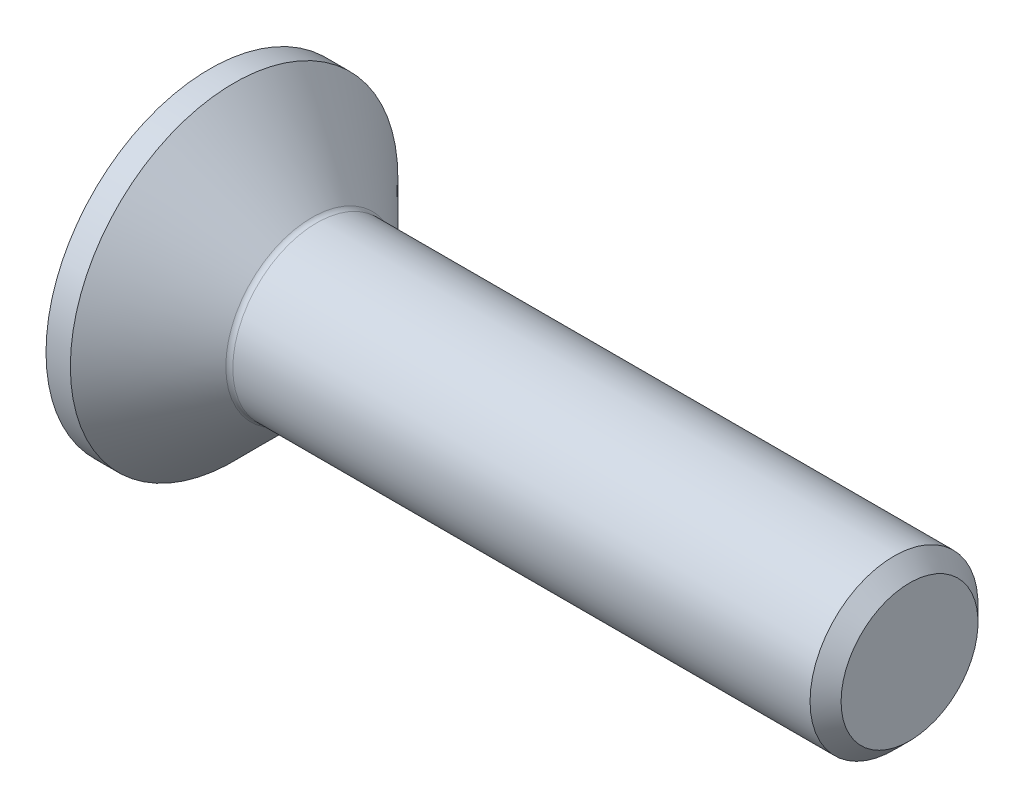
ISO-10303-21;
HEADER;
FILE_DESCRIPTION(('STEP AP214'),'2;1');
FILE_NAME('part.step','',(''),(''),'','','');
FILE_SCHEMA(('AUTOMOTIVE_DESIGN { 1 0 10303 214 1 1 1 1 }'));
ENDSEC;
DATA;
#1=APPLICATION_CONTEXT('core data for automotive mechanical design processes');
#2=APPLICATION_PROTOCOL_DEFINITION('international standard','automotive_design',2000,#1);
#3=PRODUCT_CONTEXT('',#1,'mechanical');
#4=PRODUCT('Part','Part','',(#3));
#5=PRODUCT_RELATED_PRODUCT_CATEGORY('part','',(#4));
#6=PRODUCT_DEFINITION_FORMATION('','',#4);
#7=PRODUCT_DEFINITION_CONTEXT('part definition',#1,'design');
#8=PRODUCT_DEFINITION('design','',#6,#7);
#9=PRODUCT_DEFINITION_SHAPE('','',#8);
#10=(LENGTH_UNIT() NAMED_UNIT(*) SI_UNIT(.MILLI.,.METRE.));
#11=(NAMED_UNIT(*) PLANE_ANGLE_UNIT() SI_UNIT($,.RADIAN.));
#12=(NAMED_UNIT(*) SI_UNIT($,.STERADIAN.) SOLID_ANGLE_UNIT());
#13=UNCERTAINTY_MEASURE_WITH_UNIT(LENGTH_MEASURE(1.E-05),#10,'distance_accuracy_value','');
#14=(GEOMETRIC_REPRESENTATION_CONTEXT(3) GLOBAL_UNCERTAINTY_ASSIGNED_CONTEXT((#13)) GLOBAL_UNIT_ASSIGNED_CONTEXT((#10,
#11,#12)) REPRESENTATION_CONTEXT('',''));
#15=CARTESIAN_POINT('',(0.,0.,0.));
#16=DIRECTION('',(0.,0.,1.));
#17=DIRECTION('',(1.,0.,0.));
#18=AXIS2_PLACEMENT_3D('',#15,#16,#17);
#19=CARTESIAN_POINT('',(0.,0.,0.));
#20=DIRECTION('',(-1.,0.,0.));
#21=DIRECTION('',(0.,0.,1.));
#22=AXIS2_PLACEMENT_3D('',#19,#20,#21);
#23=PLANE('',#22);
#24=CARTESIAN_POINT('',(0.,0.,0.));
#25=DIRECTION('',(-1.,0.,0.));
#26=DIRECTION('',(0.,0.,1.));
#27=AXIS2_PLACEMENT_3D('',#24,#25,#26);
#28=CIRCLE('',#27,5.85);
#29=CARTESIAN_POINT('',(0.,0.,5.85));
#30=VERTEX_POINT('',#29);
#31=EDGE_CURVE('E157',#30,#30,#28,.T.);
#32=ORIENTED_EDGE('',*,*,#31,.T.);
#33=EDGE_LOOP('',(#32));
#34=FACE_BOUND('',#33,.T.);
#35=DIRECTION('',(0.,-0.5,-0.866025403784439));
#36=VECTOR('',#35,1.);
#37=CARTESIAN_POINT('',(0.,-1.15470053837925,2.));
#38=LINE('',#37,#36);
#39=CARTESIAN_POINT('',(0.,-1.15470053837925,2.));
#40=VERTEX_POINT('',#39);
#41=CARTESIAN_POINT('',(0.,-2.3094010767585,0.));
#42=VERTEX_POINT('',#41);
#43=EDGE_CURVE('E119',#40,#42,#38,.T.);
#44=ORIENTED_EDGE('',*,*,#43,.T.);
#45=DIRECTION('',(0.,0.5,-0.866025403784439));
#46=VECTOR('',#45,1.);
#47=CARTESIAN_POINT('',(0.,-2.3094010767585,0.));
#48=LINE('',#47,#46);
#49=CARTESIAN_POINT('',(0.,-1.15470053837925,-2.));
#50=VERTEX_POINT('',#49);
#51=EDGE_CURVE('E49',#42,#50,#48,.T.);
#52=ORIENTED_EDGE('',*,*,#51,.T.);
#53=DIRECTION('',(0.,1.,0.));
#54=VECTOR('',#53,1.);
#55=CARTESIAN_POINT('',(0.,-1.15470053837925,-2.));
#56=LINE('',#55,#54);
#57=CARTESIAN_POINT('',(0.,1.15470053837925,-2.));
#58=VERTEX_POINT('',#57);
#59=EDGE_CURVE('E134',#50,#58,#56,.T.);
#60=ORIENTED_EDGE('',*,*,#59,.T.);
#61=DIRECTION('',(0.,0.5,0.866025403784439));
#62=VECTOR('',#61,1.);
#63=CARTESIAN_POINT('',(0.,1.15470053837925,-2.));
#64=LINE('',#63,#62);
#65=CARTESIAN_POINT('',(0.,2.3094010767585,0.));
#66=VERTEX_POINT('',#65);
#67=EDGE_CURVE('E270',#58,#66,#64,.T.);
#68=ORIENTED_EDGE('',*,*,#67,.T.);
#69=DIRECTION('',(0.,-0.5,0.866025403784439));
#70=VECTOR('',#69,1.);
#71=CARTESIAN_POINT('',(0.,2.3094010767585,0.));
#72=LINE('',#71,#70);
#73=CARTESIAN_POINT('',(0.,1.15470053837925,2.));
#74=VERTEX_POINT('',#73);
#75=EDGE_CURVE('E273',#66,#74,#72,.T.);
#76=ORIENTED_EDGE('',*,*,#75,.T.);
#77=DIRECTION('',(0.,-1.,0.));
#78=VECTOR('',#77,1.);
#79=CARTESIAN_POINT('',(0.,1.15470053837925,2.));
#80=LINE('',#79,#78);
#81=EDGE_CURVE('E276',#74,#40,#80,.T.);
#82=ORIENTED_EDGE('',*,*,#81,.T.);
#83=EDGE_LOOP('',(#44,#52,#60,#68,#76,#82));
#84=FACE_BOUND('',#83,.T.);
#85=ADVANCED_FACE('F34',(#34,#84),#23,.T.);
#86=CARTESIAN_POINT('',(0.,0.,0.));
#87=DIRECTION('',(-1.,0.,0.));
#88=DIRECTION('',(0.,0.,1.));
#89=AXIS2_PLACEMENT_3D('',#86,#87,#88);
#90=CYLINDRICAL_SURFACE('',#89,5.85);
#91=CARTESIAN_POINT('',(0.870000000000012,0.,0.));
#92=DIRECTION('',(-1.,0.,0.));
#93=DIRECTION('',(0.,0.,1.));
#94=AXIS2_PLACEMENT_3D('',#91,#92,#93);
#95=CIRCLE('',#94,5.85);
#96=CARTESIAN_POINT('',(0.870000000000012,0.,5.85));
#97=VERTEX_POINT('',#96);
#98=EDGE_CURVE('E154',#97,#97,#95,.T.);
#99=ORIENTED_EDGE('',*,*,#98,.T.);
#100=EDGE_LOOP('',(#99));
#101=FACE_BOUND('',#100,.T.);
#102=ORIENTED_EDGE('',*,*,#31,.F.);
#103=EDGE_LOOP('',(#102));
#104=FACE_BOUND('',#103,.T.);
#105=ADVANCED_FACE('F178',(#101,#104),#90,.T.);
#106=CARTESIAN_POINT('',(0.870000000000012,0.,0.));
#107=DIRECTION('',(-1.,0.,0.));
#108=DIRECTION('',(0.,0.,1.));
#109=AXIS2_PLACEMENT_3D('',#106,#107,#108);
#110=CONICAL_SURFACE('',#109,5.85,0.78539816339745);
#111=CARTESIAN_POINT('',(3.64677669529671,0.,0.));
#112=DIRECTION('',(-1.,0.,0.));
#113=DIRECTION('',(0.,0.,1.));
#114=AXIS2_PLACEMENT_3D('',#111,#112,#113);
#115=CIRCLE('',#114,3.0732233047033);
#116=CARTESIAN_POINT('',(3.64677669529671,0.,3.0732233047033));
#117=VERTEX_POINT('',#116);
#118=EDGE_CURVE('E42',#117,#117,#115,.T.);
#119=ORIENTED_EDGE('',*,*,#118,.T.);
#120=EDGE_LOOP('',(#119));
#121=FACE_BOUND('',#120,.T.);
#122=ORIENTED_EDGE('',*,*,#98,.F.);
#123=EDGE_LOOP('',(#122));
#124=FACE_BOUND('',#123,.T.);
#125=ADVANCED_FACE('F162',(#121,#124),#110,.T.);
#126=CARTESIAN_POINT('',(0.,0.,0.));
#127=DIRECTION('',(-1.,0.,0.));
#128=DIRECTION('',(0.,0.,1.));
#129=AXIS2_PLACEMENT_3D('',#126,#127,#128);
#130=CYLINDRICAL_SURFACE('',#129,2.99999999999993);
#131=CARTESIAN_POINT('',(3.82355339059334,0.,0.));
#132=DIRECTION('',(-1.,0.,0.));
#133=DIRECTION('',(0.,0.,1.));
#134=AXIS2_PLACEMENT_3D('',#131,#132,#133);
#135=CIRCLE('',#134,2.99999999999993);
#136=CARTESIAN_POINT('',(3.82355339059334,0.,2.99999999999993));
#137=VERTEX_POINT('',#136);
#138=EDGE_CURVE('E11',#137,#137,#135,.F.);
#139=ORIENTED_EDGE('',*,*,#138,.T.);
#140=EDGE_LOOP('',(#139));
#141=FACE_BOUND('',#140,.T.);
#142=CARTESIAN_POINT('',(24.4454999999999,0.,0.));
#143=DIRECTION('',(-1.,0.,0.));
#144=DIRECTION('',(0.,0.,1.));
#145=AXIS2_PLACEMENT_3D('',#142,#143,#144);
#146=CIRCLE('',#145,2.99999999999986);
#147=CARTESIAN_POINT('',(24.4454999999999,0.,2.99999999999986));
#148=VERTEX_POINT('',#147);
#149=EDGE_CURVE('E151',#148,#148,#146,.T.);
#150=ORIENTED_EDGE('',*,*,#149,.T.);
#151=EDGE_LOOP('',(#150));
#152=FACE_BOUND('',#151,.T.);
#153=ADVANCED_FACE('F189',(#141,#152),#130,.T.);
#154=CARTESIAN_POINT('',(25.,0.,0.));
#155=DIRECTION('',(-1.,0.,0.));
#156=DIRECTION('',(0.,0.,1.));
#157=AXIS2_PLACEMENT_3D('',#154,#155,#156);
#158=CONICAL_SURFACE('',#157,2.4455,0.785398163397224);
#159=ORIENTED_EDGE('',*,*,#149,.F.);
#160=EDGE_LOOP('',(#159));
#161=FACE_BOUND('',#160,.T.);
#162=CARTESIAN_POINT('',(25.,0.,0.));
#163=DIRECTION('',(-1.,0.,0.));
#164=DIRECTION('',(0.,0.,1.));
#165=AXIS2_PLACEMENT_3D('',#162,#163,#164);
#166=CIRCLE('',#165,2.4455);
#167=CARTESIAN_POINT('',(25.,0.,2.4455));
#168=VERTEX_POINT('',#167);
#169=EDGE_CURVE('E147',#168,#168,#166,.T.);
#170=ORIENTED_EDGE('',*,*,#169,.T.);
#171=EDGE_LOOP('',(#170));
#172=FACE_BOUND('',#171,.T.);
#173=ADVANCED_FACE('F173',(#161,#172),#158,.T.);
#174=CARTESIAN_POINT('',(25.,2.4455,0.));
#175=DIRECTION('',(1.,0.,0.));
#176=DIRECTION('',(0.,0.,-1.));
#177=AXIS2_PLACEMENT_3D('',#174,#175,#176);
#178=PLANE('',#177);
#179=ORIENTED_EDGE('',*,*,#169,.F.);
#180=EDGE_LOOP('',(#179));
#181=FACE_BOUND('',#180,.T.);
#182=ADVANCED_FACE('F166',(#181),#178,.T.);
#183=CARTESIAN_POINT('',(3.82355339059334,0.,0.));
#184=DIRECTION('',(-1.,0.,0.));
#185=DIRECTION('',(0.,0.,1.));
#186=AXIS2_PLACEMENT_3D('',#183,#184,#185);
#187=TOROIDAL_SURFACE('',#186,3.24999999999993,0.25);
#188=ORIENTED_EDGE('',*,*,#138,.F.);
#189=EDGE_LOOP('',(#188));
#190=FACE_BOUND('',#189,.T.);
#191=ORIENTED_EDGE('',*,*,#118,.F.);
#192=EDGE_LOOP('',(#191));
#193=FACE_BOUND('',#192,.T.);
#194=ADVANCED_FACE('F36',(#190,#193),#187,.F.);
#195=CARTESIAN_POINT('',(2.2,-2.3094010767585,0.));
#196=DIRECTION('',(0.,0.866025403784439,0.5));
#197=DIRECTION('',(0.,-0.5,0.866025403784439));
#198=AXIS2_PLACEMENT_3D('',#195,#196,#197);
#199=PLANE('',#198);
#200=ORIENTED_EDGE('',*,*,#51,.F.);
#201=DIRECTION('',(-1.,0.,0.));
#202=VECTOR('',#201,1.);
#203=CARTESIAN_POINT('',(2.2,-2.3094010767585,0.));
#204=LINE('',#203,#202);
#205=CARTESIAN_POINT('',(2.2,-2.3094010767585,0.));
#206=VERTEX_POINT('',#205);
#207=EDGE_CURVE('E267',#206,#42,#204,.T.);
#208=ORIENTED_EDGE('',*,*,#207,.F.);
#209=DIRECTION('',(0.,0.5,-0.866025403784439));
#210=VECTOR('',#209,1.);
#211=CARTESIAN_POINT('',(2.2,-2.3094010767585,0.));
#212=LINE('',#211,#210);
#213=CARTESIAN_POINT('',(2.2,-1.73205080756888,-0.999999999999999));
#214=VERTEX_POINT('',#213);
#215=EDGE_CURVE('E116',#206,#214,#212,.T.);
#216=ORIENTED_EDGE('',*,*,#215,.T.);
#217=CARTESIAN_POINT('',(2.2,-1.15470053837925,-2.));
#218=VERTEX_POINT('',#217);
#219=EDGE_CURVE('E110',#214,#218,#212,.T.);
#220=ORIENTED_EDGE('',*,*,#219,.T.);
#221=DIRECTION('',(-1.,0.,0.));
#222=VECTOR('',#221,1.);
#223=CARTESIAN_POINT('',(2.2,-1.15470053837925,-2.));
#224=LINE('',#223,#222);
#225=EDGE_CURVE('E114',#218,#50,#224,.T.);
#226=ORIENTED_EDGE('',*,*,#225,.T.);
#227=EDGE_LOOP('',(#200,#208,#216,#220,#226));
#228=FACE_BOUND('',#227,.T.);
#229=ADVANCED_FACE('F112',(#228),#199,.T.);
#230=CARTESIAN_POINT('',(2.2,-1.15470053837925,-2.));
#231=DIRECTION('',(0.,0.,1.));
#232=DIRECTION('',(0.,-1.,0.));
#233=AXIS2_PLACEMENT_3D('',#230,#231,#232);
#234=PLANE('',#233);
#235=ORIENTED_EDGE('',*,*,#59,.F.);
#236=ORIENTED_EDGE('',*,*,#225,.F.);
#237=DIRECTION('',(0.,1.,0.));
#238=VECTOR('',#237,1.);
#239=CARTESIAN_POINT('',(2.2,-1.15470053837925,-2.));
#240=LINE('',#239,#238);
#241=CARTESIAN_POINT('',(2.2,0.,-2.));
#242=VERTEX_POINT('',#241);
#243=EDGE_CURVE('E122',#218,#242,#240,.T.);
#244=ORIENTED_EDGE('',*,*,#243,.T.);
#245=CARTESIAN_POINT('',(2.2,1.15470053837925,-2.));
#246=VERTEX_POINT('',#245);
#247=EDGE_CURVE('E129',#242,#246,#240,.T.);
#248=ORIENTED_EDGE('',*,*,#247,.T.);
#249=DIRECTION('',(-1.,0.,0.));
#250=VECTOR('',#249,1.);
#251=CARTESIAN_POINT('',(2.2,1.15470053837925,-2.));
#252=LINE('',#251,#250);
#253=EDGE_CURVE('E136',#246,#58,#252,.T.);
#254=ORIENTED_EDGE('',*,*,#253,.T.);
#255=EDGE_LOOP('',(#235,#236,#244,#248,#254));
#256=FACE_BOUND('',#255,.T.);
#257=ADVANCED_FACE('F131',(#256),#234,.T.);
#258=CARTESIAN_POINT('',(2.2,1.15470053837925,-2.));
#259=DIRECTION('',(0.,-0.866025403784439,0.5));
#260=DIRECTION('',(0.,-0.5,-0.866025403784439));
#261=AXIS2_PLACEMENT_3D('',#258,#259,#260);
#262=PLANE('',#261);
#263=ORIENTED_EDGE('',*,*,#67,.F.);
#264=ORIENTED_EDGE('',*,*,#253,.F.);
#265=DIRECTION('',(0.,0.5,0.866025403784439));
#266=VECTOR('',#265,1.);
#267=CARTESIAN_POINT('',(2.2,1.15470053837925,-2.));
#268=LINE('',#267,#266);
#269=CARTESIAN_POINT('',(2.2,1.73205080756888,-1.));
#270=VERTEX_POINT('',#269);
#271=EDGE_CURVE('E259',#246,#270,#268,.T.);
#272=ORIENTED_EDGE('',*,*,#271,.T.);
#273=CARTESIAN_POINT('',(2.2,2.3094010767585,0.));
#274=VERTEX_POINT('',#273);
#275=EDGE_CURVE('E128',#270,#274,#268,.T.);
#276=ORIENTED_EDGE('',*,*,#275,.T.);
#277=DIRECTION('',(-1.,0.,0.));
#278=VECTOR('',#277,1.);
#279=CARTESIAN_POINT('',(2.2,2.3094010767585,0.));
#280=LINE('',#279,#278);
#281=EDGE_CURVE('E142',#274,#66,#280,.T.);
#282=ORIENTED_EDGE('',*,*,#281,.T.);
#283=EDGE_LOOP('',(#263,#264,#272,#276,#282));
#284=FACE_BOUND('',#283,.T.);
#285=ADVANCED_FACE('F203',(#284),#262,.T.);
#286=CARTESIAN_POINT('',(2.2,2.3094010767585,0.));
#287=DIRECTION('',(0.,-0.866025403784438,-0.5));
#288=DIRECTION('',(0.,0.5,-0.866025403784439));
#289=AXIS2_PLACEMENT_3D('',#286,#287,#288);
#290=PLANE('',#289);
#291=ORIENTED_EDGE('',*,*,#75,.F.);
#292=ORIENTED_EDGE('',*,*,#281,.F.);
#293=DIRECTION('',(0.,-0.5,0.866025403784439));
#294=VECTOR('',#293,1.);
#295=CARTESIAN_POINT('',(2.2,2.3094010767585,0.));
#296=LINE('',#295,#294);
#297=CARTESIAN_POINT('',(2.2,1.73205080756888,1.));
#298=VERTEX_POINT('',#297);
#299=EDGE_CURVE('E57',#274,#298,#296,.T.);
#300=ORIENTED_EDGE('',*,*,#299,.T.);
#301=CARTESIAN_POINT('',(2.2,1.15470053837925,2.));
#302=VERTEX_POINT('',#301);
#303=EDGE_CURVE('E238',#298,#302,#296,.T.);
#304=ORIENTED_EDGE('',*,*,#303,.T.);
#305=DIRECTION('',(-1.,0.,0.));
#306=VECTOR('',#305,1.);
#307=CARTESIAN_POINT('',(2.2,1.15470053837925,2.));
#308=LINE('',#307,#306);
#309=EDGE_CURVE('E252',#302,#74,#308,.T.);
#310=ORIENTED_EDGE('',*,*,#309,.T.);
#311=EDGE_LOOP('',(#291,#292,#300,#304,#310));
#312=FACE_BOUND('',#311,.T.);
#313=ADVANCED_FACE('F206',(#312),#290,.T.);
#314=CARTESIAN_POINT('',(2.2,1.15470053837925,2.));
#315=DIRECTION('',(0.,0.,-1.));
#316=DIRECTION('',(-1.,0.,0.));
#317=AXIS2_PLACEMENT_3D('',#314,#315,#316);
#318=PLANE('',#317);
#319=ORIENTED_EDGE('',*,*,#81,.F.);
#320=ORIENTED_EDGE('',*,*,#309,.F.);
#321=DIRECTION('',(0.,-1.,0.));
#322=VECTOR('',#321,1.);
#323=CARTESIAN_POINT('',(2.2,1.15470053837925,2.));
#324=LINE('',#323,#322);
#325=CARTESIAN_POINT('',(2.2,0.,2.));
#326=VERTEX_POINT('',#325);
#327=EDGE_CURVE('E237',#302,#326,#324,.T.);
#328=ORIENTED_EDGE('',*,*,#327,.T.);
#329=CARTESIAN_POINT('',(2.2,-1.15470053837925,2.));
#330=VERTEX_POINT('',#329);
#331=EDGE_CURVE('E243',#326,#330,#324,.T.);
#332=ORIENTED_EDGE('',*,*,#331,.T.);
#333=DIRECTION('',(-1.,0.,0.));
#334=VECTOR('',#333,1.);
#335=CARTESIAN_POINT('',(2.2,-1.15470053837925,2.));
#336=LINE('',#335,#334);
#337=EDGE_CURVE('E282',#330,#40,#336,.T.);
#338=ORIENTED_EDGE('',*,*,#337,.T.);
#339=EDGE_LOOP('',(#319,#320,#328,#332,#338));
#340=FACE_BOUND('',#339,.T.);
#341=ADVANCED_FACE('F210',(#340),#318,.T.);
#342=CARTESIAN_POINT('',(2.2,-1.15470053837925,2.));
#343=DIRECTION('',(0.,0.866025403784439,-0.5));
#344=DIRECTION('',(0.,0.5,0.866025403784439));
#345=AXIS2_PLACEMENT_3D('',#342,#343,#344);
#346=PLANE('',#345);
#347=ORIENTED_EDGE('',*,*,#43,.F.);
#348=ORIENTED_EDGE('',*,*,#337,.F.);
#349=DIRECTION('',(0.,-0.5,-0.866025403784439));
#350=VECTOR('',#349,1.);
#351=CARTESIAN_POINT('',(2.2,-1.15470053837925,2.));
#352=LINE('',#351,#350);
#353=CARTESIAN_POINT('',(2.2,-1.73205080756888,0.999999999999999));
#354=VERTEX_POINT('',#353);
#355=EDGE_CURVE('E246',#330,#354,#352,.T.);
#356=ORIENTED_EDGE('',*,*,#355,.T.);
#357=EDGE_CURVE('E253',#354,#206,#352,.T.);
#358=ORIENTED_EDGE('',*,*,#357,.T.);
#359=ORIENTED_EDGE('',*,*,#207,.T.);
#360=EDGE_LOOP('',(#347,#348,#356,#358,#359));
#361=FACE_BOUND('',#360,.T.);
#362=ADVANCED_FACE('F213',(#361),#346,.T.);
#363=CARTESIAN_POINT('',(2.2,-3.46410161513775,2.));
#364=DIRECTION('',(-1.,0.,0.));
#365=DIRECTION('',(0.,0.,1.));
#366=AXIS2_PLACEMENT_3D('',#363,#364,#365);
#367=PLANE('',#366);
#368=CARTESIAN_POINT('',(2.2,0.,0.));
#369=DIRECTION('',(-1.,0.,0.));
#370=DIRECTION('',(0.,0.,1.));
#371=AXIS2_PLACEMENT_3D('',#368,#369,#370);
#372=CIRCLE('',#371,2.);
#373=EDGE_CURVE('E135',#354,#326,#372,.T.);
#374=ORIENTED_EDGE('',*,*,#373,.F.);
#375=ORIENTED_EDGE('',*,*,#355,.F.);
#376=ORIENTED_EDGE('',*,*,#331,.F.);
#377=EDGE_LOOP('',(#374,#375,#376));
#378=FACE_BOUND('',#377,.T.);
#379=ADVANCED_FACE('F217',(#378),#367,.T.);
#380=EDGE_CURVE('E139',#214,#354,#372,.T.);
#381=ORIENTED_EDGE('',*,*,#380,.F.);
#382=ORIENTED_EDGE('',*,*,#215,.F.);
#383=ORIENTED_EDGE('',*,*,#357,.F.);
#384=EDGE_LOOP('',(#381,#382,#383));
#385=FACE_BOUND('',#384,.T.);
#386=ADVANCED_FACE('F220',(#385),#367,.T.);
#387=EDGE_CURVE('E124',#242,#214,#372,.T.);
#388=ORIENTED_EDGE('',*,*,#387,.F.);
#389=ORIENTED_EDGE('',*,*,#243,.F.);
#390=ORIENTED_EDGE('',*,*,#219,.F.);
#391=EDGE_LOOP('',(#388,#389,#390));
#392=FACE_BOUND('',#391,.T.);
#393=ADVANCED_FACE('F123',(#392),#367,.T.);
#394=EDGE_CURVE('E255',#270,#242,#372,.T.);
#395=ORIENTED_EDGE('',*,*,#394,.F.);
#396=ORIENTED_EDGE('',*,*,#271,.F.);
#397=ORIENTED_EDGE('',*,*,#247,.F.);
#398=EDGE_LOOP('',(#395,#396,#397));
#399=FACE_BOUND('',#398,.T.);
#400=ADVANCED_FACE('F232',(#399),#367,.T.);
#401=EDGE_CURVE('E148',#298,#270,#372,.T.);
#402=ORIENTED_EDGE('',*,*,#401,.F.);
#403=ORIENTED_EDGE('',*,*,#299,.F.);
#404=ORIENTED_EDGE('',*,*,#275,.F.);
#405=EDGE_LOOP('',(#402,#403,#404));
#406=FACE_BOUND('',#405,.T.);
#407=ADVANCED_FACE('F227',(#406),#367,.T.);
#408=EDGE_CURVE('E141',#326,#298,#372,.T.);
#409=ORIENTED_EDGE('',*,*,#408,.F.);
#410=ORIENTED_EDGE('',*,*,#327,.F.);
#411=ORIENTED_EDGE('',*,*,#303,.F.);
#412=EDGE_LOOP('',(#409,#410,#411));
#413=FACE_BOUND('',#412,.T.);
#414=ADVANCED_FACE('F198',(#413),#367,.T.);
#415=CARTESIAN_POINT('',(2.2,0.,0.));
#416=DIRECTION('',(-1.,0.,0.));
#417=DIRECTION('',(0.,0.,1.));
#418=AXIS2_PLACEMENT_3D('',#415,#416,#417);
#419=CONICAL_SURFACE('',#418,2.,1.04719755119659);
#420=CARTESIAN_POINT('',(3.35470053837926,0.,0.));
#421=VERTEX_POINT('',#420);
#422=VERTEX_LOOP('',#421);
#423=FACE_BOUND('',#422,.T.);
#424=ORIENTED_EDGE('',*,*,#408,.T.);
#425=ORIENTED_EDGE('',*,*,#401,.T.);
#426=ORIENTED_EDGE('',*,*,#394,.T.);
#427=ORIENTED_EDGE('',*,*,#387,.T.);
#428=ORIENTED_EDGE('',*,*,#380,.T.);
#429=ORIENTED_EDGE('',*,*,#373,.T.);
#430=EDGE_LOOP('',(#424,#425,#426,#427,#428,#429));
#431=FACE_BOUND('',#430,.T.);
#432=ADVANCED_FACE('F196',(#423,#431),#419,.F.);
#433=CLOSED_SHELL('',(#85,#105,#125,#153,#173,#182,#194,#229,#257,#285,#313,#341,#362,#379,#386,
#393,#400,#407,#414,#432));
#434=MANIFOLD_SOLID_BREP('B2',#433);
#435=ADVANCED_BREP_SHAPE_REPRESENTATION('',(#18,#434),#14);
#436=SHAPE_DEFINITION_REPRESENTATION(#9,#435);
ENDSEC;
END-ISO-10303-21;
